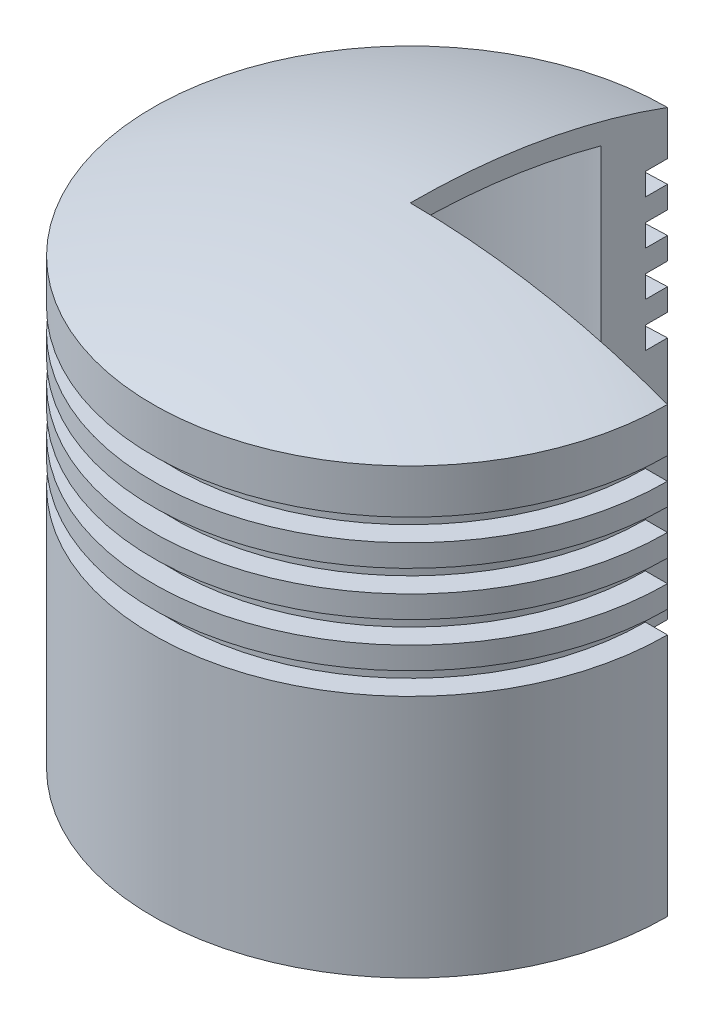
ISO-10303-21;
HEADER;
FILE_DESCRIPTION(('STEP AP214'),'2;1');
FILE_NAME('part.step','',(''),(''),'','','');
FILE_SCHEMA(('AUTOMOTIVE_DESIGN { 1 0 10303 214 1 1 1 1 }'));
ENDSEC;
DATA;
#1=APPLICATION_CONTEXT('core data for automotive mechanical design processes');
#2=APPLICATION_PROTOCOL_DEFINITION('international standard','automotive_design',2000,#1);
#3=PRODUCT_CONTEXT('',#1,'mechanical');
#4=PRODUCT('Part','Part','',(#3));
#5=PRODUCT_RELATED_PRODUCT_CATEGORY('part','',(#4));
#6=PRODUCT_DEFINITION_FORMATION('','',#4);
#7=PRODUCT_DEFINITION_CONTEXT('part definition',#1,'design');
#8=PRODUCT_DEFINITION('design','',#6,#7);
#9=PRODUCT_DEFINITION_SHAPE('','',#8);
#10=(LENGTH_UNIT() NAMED_UNIT(*) SI_UNIT(.MILLI.,.METRE.));
#11=(NAMED_UNIT(*) PLANE_ANGLE_UNIT() SI_UNIT($,.RADIAN.));
#12=(NAMED_UNIT(*) SI_UNIT($,.STERADIAN.) SOLID_ANGLE_UNIT());
#13=UNCERTAINTY_MEASURE_WITH_UNIT(LENGTH_MEASURE(1.E-05),#10,'distance_accuracy_value','');
#14=(GEOMETRIC_REPRESENTATION_CONTEXT(3) GLOBAL_UNCERTAINTY_ASSIGNED_CONTEXT((#13)) GLOBAL_UNIT_ASSIGNED_CONTEXT((#10,
#11,#12)) REPRESENTATION_CONTEXT('',''));
#15=CARTESIAN_POINT('',(0.,0.,0.));
#16=DIRECTION('',(0.,0.,1.));
#17=DIRECTION('',(1.,0.,0.));
#18=AXIS2_PLACEMENT_3D('',#15,#16,#17);
#19=CARTESIAN_POINT('',(6.65702584908989E-13,147.225952056268,-58.));
#20=DIRECTION('',(0.,1.,0.));
#21=DIRECTION('',(-1.,0.,0.));
#22=AXIS2_PLACEMENT_3D('',#19,#20,#21);
#23=PLANE('',#22);
#24=CARTESIAN_POINT('',(0.,147.225952056268,0.));
#25=DIRECTION('',(0.,1.,0.));
#26=DIRECTION('',(-1.,0.,0.));
#27=AXIS2_PLACEMENT_3D('',#24,#25,#26);
#28=CIRCLE('',#27,58.);
#29=CARTESIAN_POINT('',(6.65702584908989E-13,147.225952056268,-58.));
#30=VERTEX_POINT('',#29);
#31=CARTESIAN_POINT('',(58.,147.225952056268,0.));
#32=VERTEX_POINT('',#31);
#33=EDGE_CURVE('E11',#30,#32,#28,.T.);
#34=ORIENTED_EDGE('',*,*,#33,.F.);
#35=DIRECTION('',(0.,0.,-1.));
#36=VECTOR('',#35,1.);
#37=CARTESIAN_POINT('',(6.65702584908989E-13,147.225952056268,-58.));
#38=LINE('',#37,#36);
#39=CARTESIAN_POINT('',(6.13330364826342E-13,147.225952056268,-53.));
#40=VERTEX_POINT('',#39);
#41=EDGE_CURVE('E275',#40,#30,#38,.T.);
#42=ORIENTED_EDGE('',*,*,#41,.F.);
#43=CARTESIAN_POINT('',(0.,147.225952056268,0.));
#44=DIRECTION('',(0.,1.,0.));
#45=DIRECTION('',(-1.,0.,0.));
#46=AXIS2_PLACEMENT_3D('',#43,#44,#45);
#47=CIRCLE('',#46,53.);
#48=CARTESIAN_POINT('',(53.0000000000001,147.225952056268,0.));
#49=VERTEX_POINT('',#48);
#50=EDGE_CURVE('E53',#40,#49,#47,.T.);
#51=ORIENTED_EDGE('',*,*,#50,.T.);
#52=DIRECTION('',(1.,0.,0.));
#53=VECTOR('',#52,1.);
#54=CARTESIAN_POINT('',(58.,147.225952056268,0.));
#55=LINE('',#54,#53);
#56=EDGE_CURVE('E204',#49,#32,#55,.T.);
#57=ORIENTED_EDGE('',*,*,#56,.T.);
#58=EDGE_LOOP('',(#34,#42,#51,#57));
#59=FACE_BOUND('',#58,.T.);
#60=ADVANCED_FACE('F39',(#59),#23,.F.);
#61=CARTESIAN_POINT('',(0.,598.051491246346,0.));
#62=DIRECTION('',(0.,1.,0.));
#63=DIRECTION('',(-1.,0.,0.));
#64=AXIS2_PLACEMENT_3D('',#61,#62,#63);
#65=CYLINDRICAL_SURFACE('',#64,58.);
#66=CARTESIAN_POINT('',(0.,157.225952056268,0.));
#67=DIRECTION('',(0.,1.,0.));
#68=DIRECTION('',(-1.,0.,0.));
#69=AXIS2_PLACEMENT_3D('',#66,#67,#68);
#70=CIRCLE('',#69,58.);
#71=CARTESIAN_POINT('',(6.63016697960346E-13,157.225952056268,-58.));
#72=VERTEX_POINT('',#71);
#73=CARTESIAN_POINT('',(58.,157.225952056268,0.));
#74=VERTEX_POINT('',#73);
#75=EDGE_CURVE('E50',#72,#74,#70,.T.);
#76=ORIENTED_EDGE('',*,*,#75,.F.);
#77=DIRECTION('',(0.,1.,0.));
#78=VECTOR('',#77,1.);
#79=CARTESIAN_POINT('',(6.63016697960346E-13,157.225952056268,-58.));
#80=LINE('',#79,#78);
#81=EDGE_CURVE('E200',#30,#72,#80,.T.);
#82=ORIENTED_EDGE('',*,*,#81,.F.);
#83=ORIENTED_EDGE('',*,*,#33,.T.);
#84=DIRECTION('',(0.,1.,0.));
#85=VECTOR('',#84,1.);
#86=CARTESIAN_POINT('',(58.,157.225952056268,0.));
#87=LINE('',#86,#85);
#88=EDGE_CURVE('E197',#32,#74,#87,.T.);
#89=ORIENTED_EDGE('',*,*,#88,.T.);
#90=EDGE_LOOP('',(#76,#82,#83,#89));
#91=FACE_BOUND('',#90,.T.);
#92=ADVANCED_FACE('F41',(#91),#65,.T.);
#93=CARTESIAN_POINT('',(0.,0.,0.));
#94=DIRECTION('',(0.,1.,0.));
#95=DIRECTION('',(0.,0.,-1.));
#96=AXIS2_PLACEMENT_3D('',#93,#94,#95);
#97=SPHERICAL_SURFACE('',#96,167.582815348114);
#98=CARTESIAN_POINT('',(0.,0.,0.));
#99=DIRECTION('',(0.,0.,1.));
#100=DIRECTION('',(1.,0.,0.));
#101=AXIS2_PLACEMENT_3D('',#98,#99,#100);
#102=CIRCLE('',#101,167.582815348114);
#103=CARTESIAN_POINT('',(0.,167.582815348114,0.));
#104=VERTEX_POINT('',#103);
#105=EDGE_CURVE('E210',#74,#104,#102,.T.);
#106=ORIENTED_EDGE('',*,*,#105,.T.);
#107=CARTESIAN_POINT('',(0.,0.,0.));
#108=DIRECTION('',(1.,0.,0.));
#109=DIRECTION('',(0.,0.,-1.));
#110=AXIS2_PLACEMENT_3D('',#107,#108,#109);
#111=CIRCLE('',#110,167.582815348114);
#112=EDGE_CURVE('E274',#72,#104,#111,.T.);
#113=ORIENTED_EDGE('',*,*,#112,.F.);
#114=ORIENTED_EDGE('',*,*,#75,.T.);
#115=EDGE_LOOP('',(#106,#113,#114));
#116=FACE_BOUND('',#115,.T.);
#117=ADVANCED_FACE('F378',(#116),#97,.T.);
#118=CARTESIAN_POINT('',(0.,0.,0.));
#119=DIRECTION('',(0.,1.,0.));
#120=DIRECTION('',(0.,0.,1.));
#121=AXIS2_PLACEMENT_3D('',#118,#119,#120);
#122=SPHERICAL_SURFACE('',#121,163.);
#123=CARTESIAN_POINT('',(0.,157.225952056268,0.));
#124=DIRECTION('',(0.,1.,0.));
#125=DIRECTION('',(-1.,0.,0.));
#126=AXIS2_PLACEMENT_3D('',#123,#124,#125);
#127=CIRCLE('',#126,43.);
#128=CARTESIAN_POINT('',(5.05900037712405E-13,157.225952056268,-43.));
#129=VERTEX_POINT('',#128);
#130=CARTESIAN_POINT('',(43.0000000000001,157.225952056268,0.));
#131=VERTEX_POINT('',#130);
#132=EDGE_CURVE('E376',#129,#131,#127,.T.);
#133=ORIENTED_EDGE('',*,*,#132,.F.);
#134=CARTESIAN_POINT('',(0.,0.,0.));
#135=DIRECTION('',(-1.,0.,0.));
#136=DIRECTION('',(0.,0.,-1.));
#137=AXIS2_PLACEMENT_3D('',#134,#135,#136);
#138=CIRCLE('',#137,163.);
#139=CARTESIAN_POINT('',(0.,163.,6.23059559231782E-13));
#140=VERTEX_POINT('',#139);
#141=EDGE_CURVE('E282',#140,#129,#138,.T.);
#142=ORIENTED_EDGE('',*,*,#141,.F.);
#143=CARTESIAN_POINT('',(0.,0.,0.));
#144=DIRECTION('',(0.,0.,-1.));
#145=DIRECTION('',(1.,0.,0.));
#146=AXIS2_PLACEMENT_3D('',#143,#144,#145);
#147=CIRCLE('',#146,163.);
#148=EDGE_CURVE('E212',#140,#131,#147,.T.);
#149=ORIENTED_EDGE('',*,*,#148,.T.);
#150=EDGE_LOOP('',(#133,#142,#149));
#151=FACE_BOUND('',#150,.T.);
#152=ADVANCED_FACE('F454',(#151),#122,.F.);
#153=CARTESIAN_POINT('',(0.,598.051491246346,0.));
#154=DIRECTION('',(0.,1.,0.));
#155=DIRECTION('',(-1.,0.,0.));
#156=AXIS2_PLACEMENT_3D('',#153,#154,#155);
#157=CYLINDRICAL_SURFACE('',#156,43.);
#158=CARTESIAN_POINT('',(0.,87.2259520562684,0.));
#159=DIRECTION('',(0.,1.,0.));
#160=DIRECTION('',(-1.,0.,0.));
#161=AXIS2_PLACEMENT_3D('',#158,#159,#160);
#162=CIRCLE('',#161,43.);
#163=CARTESIAN_POINT('',(5.24701246352903E-13,87.2259520562683,-43.));
#164=VERTEX_POINT('',#163);
#165=CARTESIAN_POINT('',(43.,87.2259520562683,0.));
#166=VERTEX_POINT('',#165);
#167=EDGE_CURVE('E371',#164,#166,#162,.T.);
#168=ORIENTED_EDGE('',*,*,#167,.F.);
#169=DIRECTION('',(0.,-1.,0.));
#170=VECTOR('',#169,1.);
#171=CARTESIAN_POINT('',(5.05900037712405E-13,157.225952056268,-43.));
#172=LINE('',#171,#170);
#173=EDGE_CURVE('E281',#129,#164,#172,.T.);
#174=ORIENTED_EDGE('',*,*,#173,.F.);
#175=ORIENTED_EDGE('',*,*,#132,.T.);
#176=DIRECTION('',(0.,-1.,0.));
#177=VECTOR('',#176,1.);
#178=CARTESIAN_POINT('',(43.,157.225952056268,0.));
#179=LINE('',#178,#177);
#180=EDGE_CURVE('E220',#131,#166,#179,.T.);
#181=ORIENTED_EDGE('',*,*,#180,.T.);
#182=EDGE_LOOP('',(#168,#174,#175,#181));
#183=FACE_BOUND('',#182,.T.);
#184=ADVANCED_FACE('F455',(#183),#157,.F.);
#185=CARTESIAN_POINT('',(5.24701246352903E-13,87.2259520562683,-43.));
#186=DIRECTION('',(0.,1.,0.));
#187=DIRECTION('',(-1.,0.,0.));
#188=AXIS2_PLACEMENT_3D('',#185,#186,#187);
#189=PLANE('',#188);
#190=CARTESIAN_POINT('',(0.,87.2259520562684,0.));
#191=DIRECTION('',(0.,1.,0.));
#192=DIRECTION('',(-1.,0.,0.));
#193=AXIS2_PLACEMENT_3D('',#190,#191,#192);
#194=CIRCLE('',#193,50.);
#195=CARTESIAN_POINT('',(5.98022354468608E-13,87.2259520562683,-50.));
#196=VERTEX_POINT('',#195);
#197=CARTESIAN_POINT('',(50.0000000000001,87.2259520562683,0.));
#198=VERTEX_POINT('',#197);
#199=EDGE_CURVE('E375',#196,#198,#194,.T.);
#200=ORIENTED_EDGE('',*,*,#199,.F.);
#201=DIRECTION('',(0.,0.,-1.));
#202=VECTOR('',#201,1.);
#203=CARTESIAN_POINT('',(5.24701246352903E-13,87.2259520562683,-43.));
#204=LINE('',#203,#202);
#205=EDGE_CURVE('E287',#164,#196,#204,.T.);
#206=ORIENTED_EDGE('',*,*,#205,.F.);
#207=ORIENTED_EDGE('',*,*,#167,.T.);
#208=DIRECTION('',(1.,0.,0.));
#209=VECTOR('',#208,1.);
#210=CARTESIAN_POINT('',(43.,87.2259520562683,0.));
#211=LINE('',#210,#209);
#212=EDGE_CURVE('E217',#166,#198,#211,.T.);
#213=ORIENTED_EDGE('',*,*,#212,.T.);
#214=EDGE_LOOP('',(#200,#206,#207,#213));
#215=FACE_BOUND('',#214,.T.);
#216=ADVANCED_FACE('F448',(#215),#189,.F.);
#217=CARTESIAN_POINT('',(0.,598.051491246346,0.));
#218=DIRECTION('',(0.,1.,0.));
#219=DIRECTION('',(-1.,0.,0.));
#220=AXIS2_PLACEMENT_3D('',#217,#218,#219);
#221=CYLINDRICAL_SURFACE('',#220,50.);
#222=CARTESIAN_POINT('',(0.,57.2259520562683,0.));
#223=DIRECTION('',(0.,1.,0.));
#224=DIRECTION('',(-1.,0.,0.));
#225=AXIS2_PLACEMENT_3D('',#222,#223,#224);
#226=CIRCLE('',#225,50.);
#227=CARTESIAN_POINT('',(6.06080015314536E-13,57.2259520562683,-50.));
#228=VERTEX_POINT('',#227);
#229=CARTESIAN_POINT('',(50.0000000000001,57.2259520562683,0.));
#230=VERTEX_POINT('',#229);
#231=EDGE_CURVE('E369',#228,#230,#226,.T.);
#232=ORIENTED_EDGE('',*,*,#231,.F.);
#233=DIRECTION('',(0.,-1.,0.));
#234=VECTOR('',#233,1.);
#235=CARTESIAN_POINT('',(6.06080015314536E-13,57.2259520562683,-50.));
#236=LINE('',#235,#234);
#237=EDGE_CURVE('E290',#196,#228,#236,.T.);
#238=ORIENTED_EDGE('',*,*,#237,.F.);
#239=ORIENTED_EDGE('',*,*,#199,.T.);
#240=DIRECTION('',(0.,-1.,0.));
#241=VECTOR('',#240,1.);
#242=CARTESIAN_POINT('',(50.0000000000001,57.2259520562683,0.));
#243=LINE('',#242,#241);
#244=EDGE_CURVE('E223',#198,#230,#243,.T.);
#245=ORIENTED_EDGE('',*,*,#244,.T.);
#246=EDGE_LOOP('',(#232,#238,#239,#245));
#247=FACE_BOUND('',#246,.T.);
#248=ADVANCED_FACE('F444',(#247),#221,.F.);
#249=CARTESIAN_POINT('',(6.89875567446771E-13,57.2259520562683,-58.));
#250=DIRECTION('',(0.,1.,0.));
#251=DIRECTION('',(-1.,0.,0.));
#252=AXIS2_PLACEMENT_3D('',#249,#250,#251);
#253=PLANE('',#252);
#254=CARTESIAN_POINT('',(0.,57.2259520562683,0.));
#255=DIRECTION('',(0.,1.,0.));
#256=DIRECTION('',(-1.,0.,0.));
#257=AXIS2_PLACEMENT_3D('',#254,#255,#256);
#258=CIRCLE('',#257,58.);
#259=CARTESIAN_POINT('',(6.89875567446771E-13,57.2259520562683,-58.));
#260=VERTEX_POINT('',#259);
#261=CARTESIAN_POINT('',(58.0000000000001,57.2259520562683,0.));
#262=VERTEX_POINT('',#261);
#263=EDGE_CURVE('E367',#260,#262,#258,.T.);
#264=ORIENTED_EDGE('',*,*,#263,.F.);
#265=DIRECTION('',(0.,0.,-1.));
#266=VECTOR('',#265,1.);
#267=CARTESIAN_POINT('',(6.89875567446771E-13,57.2259520562683,-58.));
#268=LINE('',#267,#266);
#269=EDGE_CURVE('E291',#228,#260,#268,.T.);
#270=ORIENTED_EDGE('',*,*,#269,.F.);
#271=ORIENTED_EDGE('',*,*,#231,.T.);
#272=DIRECTION('',(1.,0.,0.));
#273=VECTOR('',#272,1.);
#274=CARTESIAN_POINT('',(58.0000000000001,57.2259520562683,0.));
#275=LINE('',#274,#273);
#276=EDGE_CURVE('E226',#230,#262,#275,.T.);
#277=ORIENTED_EDGE('',*,*,#276,.T.);
#278=EDGE_LOOP('',(#264,#270,#271,#277));
#279=FACE_BOUND('',#278,.T.);
#280=ADVANCED_FACE('F443',(#279),#253,.F.);
#281=CARTESIAN_POINT('',(0.,598.051491246346,0.));
#282=DIRECTION('',(0.,1.,0.));
#283=DIRECTION('',(-1.,0.,0.));
#284=AXIS2_PLACEMENT_3D('',#281,#282,#283);
#285=CYLINDRICAL_SURFACE('',#284,58.0000000000001);
#286=CARTESIAN_POINT('',(0.,112.225952056268,0.));
#287=DIRECTION('',(0.,1.,0.));
#288=DIRECTION('',(-1.,0.,0.));
#289=AXIS2_PLACEMENT_3D('',#286,#287,#288);
#290=CIRCLE('',#289,58.0000000000003);
#291=CARTESIAN_POINT('',(6.75103189229241E-13,112.225952056268,-58.0000000000003));
#292=VERTEX_POINT('',#291);
#293=CARTESIAN_POINT('',(58.0000000000004,112.225952056268,0.));
#294=VERTEX_POINT('',#293);
#295=EDGE_CURVE('E366',#292,#294,#290,.T.);
#296=ORIENTED_EDGE('',*,*,#295,.F.);
#297=DIRECTION('',(0.,1.,0.));
#298=VECTOR('',#297,1.);
#299=CARTESIAN_POINT('',(6.75103189229241E-13,112.225952056268,-58.0000000000003));
#300=LINE('',#299,#298);
#301=EDGE_CURVE('E296',#260,#292,#300,.T.);
#302=ORIENTED_EDGE('',*,*,#301,.F.);
#303=ORIENTED_EDGE('',*,*,#263,.T.);
#304=DIRECTION('',(0.,1.,0.));
#305=VECTOR('',#304,1.);
#306=CARTESIAN_POINT('',(58.0000000000004,112.225952056268,0.));
#307=LINE('',#306,#305);
#308=EDGE_CURVE('E227',#262,#294,#307,.T.);
#309=ORIENTED_EDGE('',*,*,#308,.T.);
#310=EDGE_LOOP('',(#296,#302,#303,#309));
#311=FACE_BOUND('',#310,.T.);
#312=ADVANCED_FACE('F437',(#311),#285,.T.);
#313=CARTESIAN_POINT('',(6.22730969146594E-13,112.225952056268,-53.0000000000003));
#314=DIRECTION('',(0.,-1.,0.));
#315=DIRECTION('',(1.,0.,0.));
#316=AXIS2_PLACEMENT_3D('',#313,#314,#315);
#317=PLANE('',#316);
#318=CARTESIAN_POINT('',(0.,112.225952056268,0.));
#319=DIRECTION('',(0.,1.,0.));
#320=DIRECTION('',(-1.,0.,0.));
#321=AXIS2_PLACEMENT_3D('',#318,#319,#320);
#322=CIRCLE('',#321,53.0000000000003);
#323=CARTESIAN_POINT('',(6.22730969146594E-13,112.225952056268,-53.0000000000003));
#324=VERTEX_POINT('',#323);
#325=CARTESIAN_POINT('',(53.0000000000004,112.225952056268,0.));
#326=VERTEX_POINT('',#325);
#327=EDGE_CURVE('E362',#324,#326,#322,.T.);
#328=ORIENTED_EDGE('',*,*,#327,.F.);
#329=DIRECTION('',(0.,0.,1.));
#330=VECTOR('',#329,1.);
#331=CARTESIAN_POINT('',(6.22730969146594E-13,112.225952056268,-53.0000000000003));
#332=LINE('',#331,#330);
#333=EDGE_CURVE('E298',#292,#324,#332,.T.);
#334=ORIENTED_EDGE('',*,*,#333,.F.);
#335=ORIENTED_EDGE('',*,*,#295,.T.);
#336=DIRECTION('',(-1.,0.,0.));
#337=VECTOR('',#336,1.);
#338=CARTESIAN_POINT('',(53.0000000000004,112.225952056268,0.));
#339=LINE('',#338,#337);
#340=EDGE_CURVE('E235',#294,#326,#339,.T.);
#341=ORIENTED_EDGE('',*,*,#340,.T.);
#342=EDGE_LOOP('',(#328,#334,#335,#341));
#343=FACE_BOUND('',#342,.T.);
#344=ADVANCED_FACE('F432',(#343),#317,.F.);
#345=CARTESIAN_POINT('',(0.,598.051491246346,0.));
#346=DIRECTION('',(0.,1.,0.));
#347=DIRECTION('',(-1.,0.,0.));
#348=AXIS2_PLACEMENT_3D('',#345,#346,#347);
#349=CYLINDRICAL_SURFACE('',#348,53.0000000000003);
#350=CARTESIAN_POINT('',(0.,117.225952056268,0.));
#351=DIRECTION('',(0.,1.,0.));
#352=DIRECTION('',(-1.,0.,0.));
#353=AXIS2_PLACEMENT_3D('',#350,#351,#352);
#354=CIRCLE('',#353,53.0000000000003);
#355=CARTESIAN_POINT('',(6.21388025672272E-13,117.225952056268,-53.0000000000003));
#356=VERTEX_POINT('',#355);
#357=CARTESIAN_POINT('',(53.0000000000004,117.225952056268,0.));
#358=VERTEX_POINT('',#357);
#359=EDGE_CURVE('E365',#356,#358,#354,.T.);
#360=ORIENTED_EDGE('',*,*,#359,.F.);
#361=DIRECTION('',(0.,1.,0.));
#362=VECTOR('',#361,1.);
#363=CARTESIAN_POINT('',(6.21388025672272E-13,117.225952056268,-53.0000000000003));
#364=LINE('',#363,#362);
#365=EDGE_CURVE('E302',#324,#356,#364,.T.);
#366=ORIENTED_EDGE('',*,*,#365,.F.);
#367=ORIENTED_EDGE('',*,*,#327,.T.);
#368=DIRECTION('',(0.,1.,0.));
#369=VECTOR('',#368,1.);
#370=CARTESIAN_POINT('',(53.0000000000004,117.225952056268,0.));
#371=LINE('',#370,#369);
#372=EDGE_CURVE('E234',#326,#358,#371,.T.);
#373=ORIENTED_EDGE('',*,*,#372,.T.);
#374=EDGE_LOOP('',(#360,#366,#367,#373));
#375=FACE_BOUND('',#374,.T.);
#376=ADVANCED_FACE('F429',(#375),#349,.T.);
#377=CARTESIAN_POINT('',(6.73760245754919E-13,117.225952056268,-58.0000000000003));
#378=DIRECTION('',(0.,1.,0.));
#379=DIRECTION('',(-1.,0.,0.));
#380=AXIS2_PLACEMENT_3D('',#377,#378,#379);
#381=PLANE('',#380);
#382=CARTESIAN_POINT('',(0.,117.225952056268,0.));
#383=DIRECTION('',(0.,1.,0.));
#384=DIRECTION('',(-1.,0.,0.));
#385=AXIS2_PLACEMENT_3D('',#382,#383,#384);
#386=CIRCLE('',#385,58.0000000000003);
#387=CARTESIAN_POINT('',(6.73760245754919E-13,117.225952056268,-58.0000000000003));
#388=VERTEX_POINT('',#387);
#389=CARTESIAN_POINT('',(58.0000000000004,117.225952056268,0.));
#390=VERTEX_POINT('',#389);
#391=EDGE_CURVE('E359',#388,#390,#386,.T.);
#392=ORIENTED_EDGE('',*,*,#391,.F.);
#393=DIRECTION('',(0.,0.,-1.));
#394=VECTOR('',#393,1.);
#395=CARTESIAN_POINT('',(6.73760245754919E-13,117.225952056268,-58.0000000000003));
#396=LINE('',#395,#394);
#397=EDGE_CURVE('E304',#356,#388,#396,.T.);
#398=ORIENTED_EDGE('',*,*,#397,.F.);
#399=ORIENTED_EDGE('',*,*,#359,.T.);
#400=DIRECTION('',(1.,0.,0.));
#401=VECTOR('',#400,1.);
#402=CARTESIAN_POINT('',(58.0000000000004,117.225952056268,0.));
#403=LINE('',#402,#401);
#404=EDGE_CURVE('E239',#358,#390,#403,.T.);
#405=ORIENTED_EDGE('',*,*,#404,.T.);
#406=EDGE_LOOP('',(#392,#398,#399,#405));
#407=FACE_BOUND('',#406,.T.);
#408=ADVANCED_FACE('F425',(#407),#381,.F.);
#409=CARTESIAN_POINT('',(0.,598.051491246346,0.));
#410=DIRECTION('',(0.,1.,0.));
#411=DIRECTION('',(-1.,0.,0.));
#412=AXIS2_PLACEMENT_3D('',#409,#410,#411);
#413=CYLINDRICAL_SURFACE('',#412,58.0000000000002);
#414=CARTESIAN_POINT('',(0.,122.225952056268,0.));
#415=DIRECTION('',(0.,1.,0.));
#416=DIRECTION('',(-1.,0.,0.));
#417=AXIS2_PLACEMENT_3D('',#414,#415,#416);
#418=CIRCLE('',#417,58.0000000000002);
#419=CARTESIAN_POINT('',(6.72417302280597E-13,122.225952056268,-58.0000000000002));
#420=VERTEX_POINT('',#419);
#421=CARTESIAN_POINT('',(58.0000000000003,122.225952056268,0.));
#422=VERTEX_POINT('',#421);
#423=EDGE_CURVE('E358',#420,#422,#418,.T.);
#424=ORIENTED_EDGE('',*,*,#423,.F.);
#425=DIRECTION('',(0.,1.,0.));
#426=VECTOR('',#425,1.);
#427=CARTESIAN_POINT('',(6.72417302280597E-13,122.225952056268,-58.0000000000002));
#428=LINE('',#427,#426);
#429=EDGE_CURVE('E306',#388,#420,#428,.T.);
#430=ORIENTED_EDGE('',*,*,#429,.F.);
#431=ORIENTED_EDGE('',*,*,#391,.T.);
#432=DIRECTION('',(0.,1.,0.));
#433=VECTOR('',#432,1.);
#434=CARTESIAN_POINT('',(58.0000000000003,122.225952056268,0.));
#435=LINE('',#434,#433);
#436=EDGE_CURVE('E241',#390,#422,#435,.T.);
#437=ORIENTED_EDGE('',*,*,#436,.T.);
#438=EDGE_LOOP('',(#424,#430,#431,#437));
#439=FACE_BOUND('',#438,.T.);
#440=ADVANCED_FACE('F418',(#439),#413,.T.);
#441=CARTESIAN_POINT('',(6.2004508219795E-13,122.225952056268,-53.0000000000002));
#442=DIRECTION('',(0.,-1.,0.));
#443=DIRECTION('',(1.,0.,0.));
#444=AXIS2_PLACEMENT_3D('',#441,#442,#443);
#445=PLANE('',#444);
#446=CARTESIAN_POINT('',(0.,122.225952056268,0.));
#447=DIRECTION('',(0.,1.,0.));
#448=DIRECTION('',(-1.,0.,0.));
#449=AXIS2_PLACEMENT_3D('',#446,#447,#448);
#450=CIRCLE('',#449,53.0000000000002);
#451=CARTESIAN_POINT('',(6.2004508219795E-13,122.225952056268,-53.0000000000002));
#452=VERTEX_POINT('',#451);
#453=CARTESIAN_POINT('',(53.0000000000003,122.225952056268,0.));
#454=VERTEX_POINT('',#453);
#455=EDGE_CURVE('E356',#452,#454,#450,.T.);
#456=ORIENTED_EDGE('',*,*,#455,.F.);
#457=DIRECTION('',(0.,0.,1.));
#458=VECTOR('',#457,1.);
#459=CARTESIAN_POINT('',(6.2004508219795E-13,122.225952056268,-53.0000000000002));
#460=LINE('',#459,#458);
#461=EDGE_CURVE('E311',#420,#452,#460,.T.);
#462=ORIENTED_EDGE('',*,*,#461,.F.);
#463=ORIENTED_EDGE('',*,*,#423,.T.);
#464=DIRECTION('',(-1.,0.,0.));
#465=VECTOR('',#464,1.);
#466=CARTESIAN_POINT('',(53.0000000000003,122.225952056268,0.));
#467=LINE('',#466,#465);
#468=EDGE_CURVE('E243',#422,#454,#467,.T.);
#469=ORIENTED_EDGE('',*,*,#468,.T.);
#470=EDGE_LOOP('',(#456,#462,#463,#469));
#471=FACE_BOUND('',#470,.T.);
#472=ADVANCED_FACE('F420',(#471),#445,.F.);
#473=CARTESIAN_POINT('',(0.,598.051491246346,0.));
#474=DIRECTION('',(0.,1.,0.));
#475=DIRECTION('',(-1.,0.,0.));
#476=AXIS2_PLACEMENT_3D('',#473,#474,#475);
#477=CYLINDRICAL_SURFACE('',#476,53.0000000000002);
#478=CARTESIAN_POINT('',(0.,127.225952056268,0.));
#479=DIRECTION('',(0.,1.,0.));
#480=DIRECTION('',(-1.,0.,0.));
#481=AXIS2_PLACEMENT_3D('',#478,#479,#480);
#482=CIRCLE('',#481,53.0000000000002);
#483=CARTESIAN_POINT('',(6.18702138723629E-13,127.225952056268,-53.0000000000002));
#484=VERTEX_POINT('',#483);
#485=CARTESIAN_POINT('',(53.0000000000003,127.225952056268,0.));
#486=VERTEX_POINT('',#485);
#487=EDGE_CURVE('E354',#484,#486,#482,.T.);
#488=ORIENTED_EDGE('',*,*,#487,.F.);
#489=DIRECTION('',(0.,1.,0.));
#490=VECTOR('',#489,1.);
#491=CARTESIAN_POINT('',(6.18702138723629E-13,127.225952056268,-53.0000000000002));
#492=LINE('',#491,#490);
#493=EDGE_CURVE('E312',#452,#484,#492,.T.);
#494=ORIENTED_EDGE('',*,*,#493,.F.);
#495=ORIENTED_EDGE('',*,*,#455,.T.);
#496=DIRECTION('',(0.,1.,0.));
#497=VECTOR('',#496,1.);
#498=CARTESIAN_POINT('',(53.0000000000003,127.225952056268,0.));
#499=LINE('',#498,#497);
#500=EDGE_CURVE('E250',#454,#486,#499,.T.);
#501=ORIENTED_EDGE('',*,*,#500,.T.);
#502=EDGE_LOOP('',(#488,#494,#495,#501));
#503=FACE_BOUND('',#502,.T.);
#504=ADVANCED_FACE('F412',(#503),#477,.T.);
#505=CARTESIAN_POINT('',(6.71074358806276E-13,127.225952056268,-58.0000000000002));
#506=DIRECTION('',(0.,1.,0.));
#507=DIRECTION('',(-1.,0.,0.));
#508=AXIS2_PLACEMENT_3D('',#505,#506,#507);
#509=PLANE('',#508);
#510=CARTESIAN_POINT('',(0.,127.225952056268,0.));
#511=DIRECTION('',(0.,1.,0.));
#512=DIRECTION('',(-1.,0.,0.));
#513=AXIS2_PLACEMENT_3D('',#510,#511,#512);
#514=CIRCLE('',#513,58.0000000000002);
#515=CARTESIAN_POINT('',(6.71074358806276E-13,127.225952056268,-58.0000000000002));
#516=VERTEX_POINT('',#515);
#517=CARTESIAN_POINT('',(58.0000000000003,127.225952056268,0.));
#518=VERTEX_POINT('',#517);
#519=EDGE_CURVE('E355',#516,#518,#514,.T.);
#520=ORIENTED_EDGE('',*,*,#519,.F.);
#521=DIRECTION('',(0.,0.,-1.));
#522=VECTOR('',#521,1.);
#523=CARTESIAN_POINT('',(6.71074358806276E-13,127.225952056268,-58.0000000000002));
#524=LINE('',#523,#522);
#525=EDGE_CURVE('E320',#484,#516,#524,.T.);
#526=ORIENTED_EDGE('',*,*,#525,.F.);
#527=ORIENTED_EDGE('',*,*,#487,.T.);
#528=DIRECTION('',(1.,0.,0.));
#529=VECTOR('',#528,1.);
#530=CARTESIAN_POINT('',(58.0000000000003,127.225952056268,0.));
#531=LINE('',#530,#529);
#532=EDGE_CURVE('E248',#486,#518,#531,.T.);
#533=ORIENTED_EDGE('',*,*,#532,.T.);
#534=EDGE_LOOP('',(#520,#526,#527,#533));
#535=FACE_BOUND('',#534,.T.);
#536=ADVANCED_FACE('F408',(#535),#509,.F.);
#537=CARTESIAN_POINT('',(0.,598.051491246346,0.));
#538=DIRECTION('',(0.,1.,0.));
#539=DIRECTION('',(-1.,0.,0.));
#540=AXIS2_PLACEMENT_3D('',#537,#538,#539);
#541=CYLINDRICAL_SURFACE('',#540,58.0000000000001);
#542=CARTESIAN_POINT('',(0.,132.225952056268,0.));
#543=DIRECTION('',(0.,1.,0.));
#544=DIRECTION('',(-1.,0.,0.));
#545=AXIS2_PLACEMENT_3D('',#542,#543,#544);
#546=CIRCLE('',#545,58.0000000000001);
#547=CARTESIAN_POINT('',(6.69731415331954E-13,132.225952056268,-58.0000000000001));
#548=VERTEX_POINT('',#547);
#549=CARTESIAN_POINT('',(58.0000000000002,132.225952056268,0.));
#550=VERTEX_POINT('',#549);
#551=EDGE_CURVE('E349',#548,#550,#546,.T.);
#552=ORIENTED_EDGE('',*,*,#551,.F.);
#553=DIRECTION('',(0.,1.,0.));
#554=VECTOR('',#553,1.);
#555=CARTESIAN_POINT('',(6.69731415331954E-13,132.225952056268,-58.0000000000001));
#556=LINE('',#555,#554);
#557=EDGE_CURVE('E319',#516,#548,#556,.T.);
#558=ORIENTED_EDGE('',*,*,#557,.F.);
#559=ORIENTED_EDGE('',*,*,#519,.T.);
#560=DIRECTION('',(0.,1.,0.));
#561=VECTOR('',#560,1.);
#562=CARTESIAN_POINT('',(58.0000000000002,132.225952056268,0.));
#563=LINE('',#562,#561);
#564=EDGE_CURVE('E254',#518,#550,#563,.T.);
#565=ORIENTED_EDGE('',*,*,#564,.T.);
#566=EDGE_LOOP('',(#552,#558,#559,#565));
#567=FACE_BOUND('',#566,.T.);
#568=ADVANCED_FACE('F404',(#567),#541,.T.);
#569=CARTESIAN_POINT('',(6.17359195249307E-13,132.225952056268,-53.0000000000001));
#570=DIRECTION('',(0.,-1.,0.));
#571=DIRECTION('',(1.,0.,0.));
#572=AXIS2_PLACEMENT_3D('',#569,#570,#571);
#573=PLANE('',#572);
#574=CARTESIAN_POINT('',(0.,132.225952056268,0.));
#575=DIRECTION('',(0.,1.,0.));
#576=DIRECTION('',(-1.,0.,0.));
#577=AXIS2_PLACEMENT_3D('',#574,#575,#576);
#578=CIRCLE('',#577,53.0000000000001);
#579=CARTESIAN_POINT('',(6.17359195249307E-13,132.225952056268,-53.0000000000001));
#580=VERTEX_POINT('',#579);
#581=CARTESIAN_POINT('',(53.0000000000002,132.225952056268,0.));
#582=VERTEX_POINT('',#581);
#583=EDGE_CURVE('E346',#580,#582,#578,.T.);
#584=ORIENTED_EDGE('',*,*,#583,.F.);
#585=DIRECTION('',(0.,0.,1.));
#586=VECTOR('',#585,1.);
#587=CARTESIAN_POINT('',(6.17359195249307E-13,132.225952056268,-53.0000000000001));
#588=LINE('',#587,#586);
#589=EDGE_CURVE('E322',#548,#580,#588,.T.);
#590=ORIENTED_EDGE('',*,*,#589,.F.);
#591=ORIENTED_EDGE('',*,*,#551,.T.);
#592=DIRECTION('',(-1.,0.,0.));
#593=VECTOR('',#592,1.);
#594=CARTESIAN_POINT('',(53.0000000000002,132.225952056268,0.));
#595=LINE('',#594,#593);
#596=EDGE_CURVE('E258',#550,#582,#595,.T.);
#597=ORIENTED_EDGE('',*,*,#596,.T.);
#598=EDGE_LOOP('',(#584,#590,#591,#597));
#599=FACE_BOUND('',#598,.T.);
#600=ADVANCED_FACE('F401',(#599),#573,.F.);
#601=CARTESIAN_POINT('',(0.,598.051491246346,0.));
#602=DIRECTION('',(0.,1.,0.));
#603=DIRECTION('',(-1.,0.,0.));
#604=AXIS2_PLACEMENT_3D('',#601,#602,#603);
#605=CYLINDRICAL_SURFACE('',#604,53.0000000000001);
#606=CARTESIAN_POINT('',(0.,137.225952056268,0.));
#607=DIRECTION('',(0.,1.,0.));
#608=DIRECTION('',(-1.,0.,0.));
#609=AXIS2_PLACEMENT_3D('',#606,#607,#608);
#610=CIRCLE('',#609,53.0000000000001);
#611=CARTESIAN_POINT('',(6.16016251774985E-13,137.225952056268,-53.0000000000001));
#612=VERTEX_POINT('',#611);
#613=CARTESIAN_POINT('',(53.0000000000002,137.225952056268,0.));
#614=VERTEX_POINT('',#613);
#615=EDGE_CURVE('E348',#612,#614,#610,.T.);
#616=ORIENTED_EDGE('',*,*,#615,.F.);
#617=DIRECTION('',(0.,1.,0.));
#618=VECTOR('',#617,1.);
#619=CARTESIAN_POINT('',(6.16016251774985E-13,137.225952056268,-53.0000000000001));
#620=LINE('',#619,#618);
#621=EDGE_CURVE('E327',#580,#612,#620,.T.);
#622=ORIENTED_EDGE('',*,*,#621,.F.);
#623=ORIENTED_EDGE('',*,*,#583,.T.);
#624=DIRECTION('',(0.,1.,0.));
#625=VECTOR('',#624,1.);
#626=CARTESIAN_POINT('',(53.0000000000002,137.225952056268,0.));
#627=LINE('',#626,#625);
#628=EDGE_CURVE('E260',#582,#614,#627,.T.);
#629=ORIENTED_EDGE('',*,*,#628,.T.);
#630=EDGE_LOOP('',(#616,#622,#623,#629));
#631=FACE_BOUND('',#630,.T.);
#632=ADVANCED_FACE('F398',(#631),#605,.T.);
#633=CARTESIAN_POINT('',(6.68388471857632E-13,137.225952056268,-58.0000000000001));
#634=DIRECTION('',(0.,1.,0.));
#635=DIRECTION('',(-1.,0.,0.));
#636=AXIS2_PLACEMENT_3D('',#633,#634,#635);
#637=PLANE('',#636);
#638=CARTESIAN_POINT('',(0.,137.225952056268,0.));
#639=DIRECTION('',(0.,1.,0.));
#640=DIRECTION('',(-1.,0.,0.));
#641=AXIS2_PLACEMENT_3D('',#638,#639,#640);
#642=CIRCLE('',#641,58.0000000000001);
#643=CARTESIAN_POINT('',(6.68388471857632E-13,137.225952056268,-58.0000000000001));
#644=VERTEX_POINT('',#643);
#645=CARTESIAN_POINT('',(58.0000000000002,137.225952056268,0.));
#646=VERTEX_POINT('',#645);
#647=EDGE_CURVE('E343',#644,#646,#642,.T.);
#648=ORIENTED_EDGE('',*,*,#647,.F.);
#649=DIRECTION('',(0.,0.,-1.));
#650=VECTOR('',#649,1.);
#651=CARTESIAN_POINT('',(6.68388471857632E-13,137.225952056268,-58.0000000000001));
#652=LINE('',#651,#650);
#653=EDGE_CURVE('E326',#612,#644,#652,.T.);
#654=ORIENTED_EDGE('',*,*,#653,.F.);
#655=ORIENTED_EDGE('',*,*,#615,.T.);
#656=DIRECTION('',(1.,0.,0.));
#657=VECTOR('',#656,1.);
#658=CARTESIAN_POINT('',(58.0000000000002,137.225952056268,0.));
#659=LINE('',#658,#657);
#660=EDGE_CURVE('E265',#614,#646,#659,.T.);
#661=ORIENTED_EDGE('',*,*,#660,.T.);
#662=EDGE_LOOP('',(#648,#654,#655,#661));
#663=FACE_BOUND('',#662,.T.);
#664=ADVANCED_FACE('F391',(#663),#637,.F.);
#665=CARTESIAN_POINT('',(0.,598.051491246346,0.));
#666=DIRECTION('',(0.,1.,0.));
#667=DIRECTION('',(-1.,0.,0.));
#668=AXIS2_PLACEMENT_3D('',#665,#666,#667);
#669=CYLINDRICAL_SURFACE('',#668,58.);
#670=CARTESIAN_POINT('',(0.,142.225952056268,0.));
#671=DIRECTION('',(0.,1.,0.));
#672=DIRECTION('',(-1.,0.,0.));
#673=AXIS2_PLACEMENT_3D('',#670,#671,#672);
#674=CIRCLE('',#673,58.);
#675=CARTESIAN_POINT('',(6.6704552838331E-13,142.225952056268,-58.));
#676=VERTEX_POINT('',#675);
#677=CARTESIAN_POINT('',(58.,142.225952056268,0.));
#678=VERTEX_POINT('',#677);
#679=EDGE_CURVE('E342',#676,#678,#674,.T.);
#680=ORIENTED_EDGE('',*,*,#679,.F.);
#681=DIRECTION('',(0.,1.,0.));
#682=VECTOR('',#681,1.);
#683=CARTESIAN_POINT('',(6.6704552838331E-13,142.225952056268,-58.));
#684=LINE('',#683,#682);
#685=EDGE_CURVE('E332',#644,#676,#684,.T.);
#686=ORIENTED_EDGE('',*,*,#685,.F.);
#687=ORIENTED_EDGE('',*,*,#647,.T.);
#688=DIRECTION('',(0.,1.,0.));
#689=VECTOR('',#688,1.);
#690=CARTESIAN_POINT('',(58.,142.225952056268,0.));
#691=LINE('',#690,#689);
#692=EDGE_CURVE('E262',#646,#678,#691,.T.);
#693=ORIENTED_EDGE('',*,*,#692,.T.);
#694=EDGE_LOOP('',(#680,#686,#687,#693));
#695=FACE_BOUND('',#694,.T.);
#696=ADVANCED_FACE('F388',(#695),#669,.T.);
#697=CARTESIAN_POINT('',(6.14673308300663E-13,142.225952056268,-53.));
#698=DIRECTION('',(0.,-1.,0.));
#699=DIRECTION('',(1.,0.,0.));
#700=AXIS2_PLACEMENT_3D('',#697,#698,#699);
#701=PLANE('',#700);
#702=CARTESIAN_POINT('',(0.,142.225952056268,0.));
#703=DIRECTION('',(0.,1.,0.));
#704=DIRECTION('',(-1.,0.,0.));
#705=AXIS2_PLACEMENT_3D('',#702,#703,#704);
#706=CIRCLE('',#705,53.);
#707=CARTESIAN_POINT('',(6.14673308300663E-13,142.225952056268,-53.));
#708=VERTEX_POINT('',#707);
#709=CARTESIAN_POINT('',(53.0000000000001,142.225952056268,0.));
#710=VERTEX_POINT('',#709);
#711=EDGE_CURVE('E62',#708,#710,#706,.T.);
#712=ORIENTED_EDGE('',*,*,#711,.F.);
#713=DIRECTION('',(0.,0.,1.));
#714=VECTOR('',#713,1.);
#715=CARTESIAN_POINT('',(6.14673308300663E-13,142.225952056268,-53.));
#716=LINE('',#715,#714);
#717=EDGE_CURVE('E335',#676,#708,#716,.T.);
#718=ORIENTED_EDGE('',*,*,#717,.F.);
#719=ORIENTED_EDGE('',*,*,#679,.T.);
#720=DIRECTION('',(-1.,0.,0.));
#721=VECTOR('',#720,1.);
#722=CARTESIAN_POINT('',(53.0000000000001,142.225952056268,0.));
#723=LINE('',#722,#721);
#724=EDGE_CURVE('E268',#678,#710,#723,.T.);
#725=ORIENTED_EDGE('',*,*,#724,.T.);
#726=EDGE_LOOP('',(#712,#718,#719,#725));
#727=FACE_BOUND('',#726,.T.);
#728=ADVANCED_FACE('F384',(#727),#701,.F.);
#729=CARTESIAN_POINT('',(0.,598.051491246346,0.));
#730=DIRECTION('',(0.,1.,0.));
#731=DIRECTION('',(-1.,0.,0.));
#732=AXIS2_PLACEMENT_3D('',#729,#730,#731);
#733=CYLINDRICAL_SURFACE('',#732,53.);
#734=DIRECTION('',(0.,1.,0.));
#735=VECTOR('',#734,1.);
#736=CARTESIAN_POINT('',(6.13330364826342E-13,147.225952056268,-53.));
#737=LINE('',#736,#735);
#738=EDGE_CURVE('E340',#708,#40,#737,.T.);
#739=ORIENTED_EDGE('',*,*,#738,.F.);
#740=ORIENTED_EDGE('',*,*,#711,.T.);
#741=DIRECTION('',(0.,1.,0.));
#742=VECTOR('',#741,1.);
#743=CARTESIAN_POINT('',(53.0000000000001,147.225952056268,0.));
#744=LINE('',#743,#742);
#745=EDGE_CURVE('E269',#710,#49,#744,.T.);
#746=ORIENTED_EDGE('',*,*,#745,.T.);
#747=ORIENTED_EDGE('',*,*,#50,.F.);
#748=EDGE_LOOP('',(#739,#740,#746,#747));
#749=FACE_BOUND('',#748,.T.);
#750=ADVANCED_FACE('F385',(#749),#733,.T.);
#751=CARTESIAN_POINT('',(0.,0.,0.));
#752=DIRECTION('',(1.,0.,0.));
#753=DIRECTION('',(0.,0.,-1.));
#754=AXIS2_PLACEMENT_3D('',#751,#752,#753);
#755=PLANE('',#754);
#756=ORIENTED_EDGE('',*,*,#41,.T.);
#757=ORIENTED_EDGE('',*,*,#81,.T.);
#758=ORIENTED_EDGE('',*,*,#112,.T.);
#759=DIRECTION('',(0.,-1.,1.35955632488711E-13));
#760=VECTOR('',#759,1.);
#761=CARTESIAN_POINT('',(0.,167.582815348114,0.));
#762=LINE('',#761,#760);
#763=EDGE_CURVE('E277',#104,#140,#762,.T.);
#764=ORIENTED_EDGE('',*,*,#763,.T.);
#765=ORIENTED_EDGE('',*,*,#141,.T.);
#766=ORIENTED_EDGE('',*,*,#173,.T.);
#767=ORIENTED_EDGE('',*,*,#205,.T.);
#768=ORIENTED_EDGE('',*,*,#237,.T.);
#769=ORIENTED_EDGE('',*,*,#269,.T.);
#770=ORIENTED_EDGE('',*,*,#301,.T.);
#771=ORIENTED_EDGE('',*,*,#333,.T.);
#772=ORIENTED_EDGE('',*,*,#365,.T.);
#773=ORIENTED_EDGE('',*,*,#397,.T.);
#774=ORIENTED_EDGE('',*,*,#429,.T.);
#775=ORIENTED_EDGE('',*,*,#461,.T.);
#776=ORIENTED_EDGE('',*,*,#493,.T.);
#777=ORIENTED_EDGE('',*,*,#525,.T.);
#778=ORIENTED_EDGE('',*,*,#557,.T.);
#779=ORIENTED_EDGE('',*,*,#589,.T.);
#780=ORIENTED_EDGE('',*,*,#621,.T.);
#781=ORIENTED_EDGE('',*,*,#653,.T.);
#782=ORIENTED_EDGE('',*,*,#685,.T.);
#783=ORIENTED_EDGE('',*,*,#717,.T.);
#784=ORIENTED_EDGE('',*,*,#738,.T.);
#785=EDGE_LOOP('',(#756,#757,#758,#764,#765,#766,#767,#768,#769,#770,#771,#772,#773,#774,#775,
#776,#777,#778,#779,#780,#781,#782,#783,#784));
#786=FACE_BOUND('',#785,.T.);
#787=ADVANCED_FACE('F382',(#786),#755,.T.);
#788=CARTESIAN_POINT('',(0.,0.,0.));
#789=DIRECTION('',(0.,0.,1.));
#790=DIRECTION('',(1.,0.,0.));
#791=AXIS2_PLACEMENT_3D('',#788,#789,#790);
#792=PLANE('',#791);
#793=ORIENTED_EDGE('',*,*,#56,.F.);
#794=ORIENTED_EDGE('',*,*,#745,.F.);
#795=ORIENTED_EDGE('',*,*,#724,.F.);
#796=ORIENTED_EDGE('',*,*,#692,.F.);
#797=ORIENTED_EDGE('',*,*,#660,.F.);
#798=ORIENTED_EDGE('',*,*,#628,.F.);
#799=ORIENTED_EDGE('',*,*,#596,.F.);
#800=ORIENTED_EDGE('',*,*,#564,.F.);
#801=ORIENTED_EDGE('',*,*,#532,.F.);
#802=ORIENTED_EDGE('',*,*,#500,.F.);
#803=ORIENTED_EDGE('',*,*,#468,.F.);
#804=ORIENTED_EDGE('',*,*,#436,.F.);
#805=ORIENTED_EDGE('',*,*,#404,.F.);
#806=ORIENTED_EDGE('',*,*,#372,.F.);
#807=ORIENTED_EDGE('',*,*,#340,.F.);
#808=ORIENTED_EDGE('',*,*,#308,.F.);
#809=ORIENTED_EDGE('',*,*,#276,.F.);
#810=ORIENTED_EDGE('',*,*,#244,.F.);
#811=ORIENTED_EDGE('',*,*,#212,.F.);
#812=ORIENTED_EDGE('',*,*,#180,.F.);
#813=ORIENTED_EDGE('',*,*,#148,.F.);
#814=ORIENTED_EDGE('',*,*,#763,.F.);
#815=ORIENTED_EDGE('',*,*,#105,.F.);
#816=ORIENTED_EDGE('',*,*,#88,.F.);
#817=EDGE_LOOP('',(#793,#794,#795,#796,#797,#798,#799,#800,#801,#802,#803,#804,#805,#806,#807,
#808,#809,#810,#811,#812,#813,#814,#815,#816));
#818=FACE_BOUND('',#817,.T.);
#819=ADVANCED_FACE('F209',(#818),#792,.F.);
#820=CLOSED_SHELL('',(#60,#92,#117,#152,#184,#216,#248,#280,#312,#344,#376,#408,#440,#472,#504,
#536,#568,#600,#632,#664,#696,#728,#750,#787,#819));
#821=MANIFOLD_SOLID_BREP('B2',#820);
#822=ADVANCED_BREP_SHAPE_REPRESENTATION('',(#18,#821),#14);
#823=SHAPE_DEFINITION_REPRESENTATION(#9,#822);
ENDSEC;
END-ISO-10303-21;
